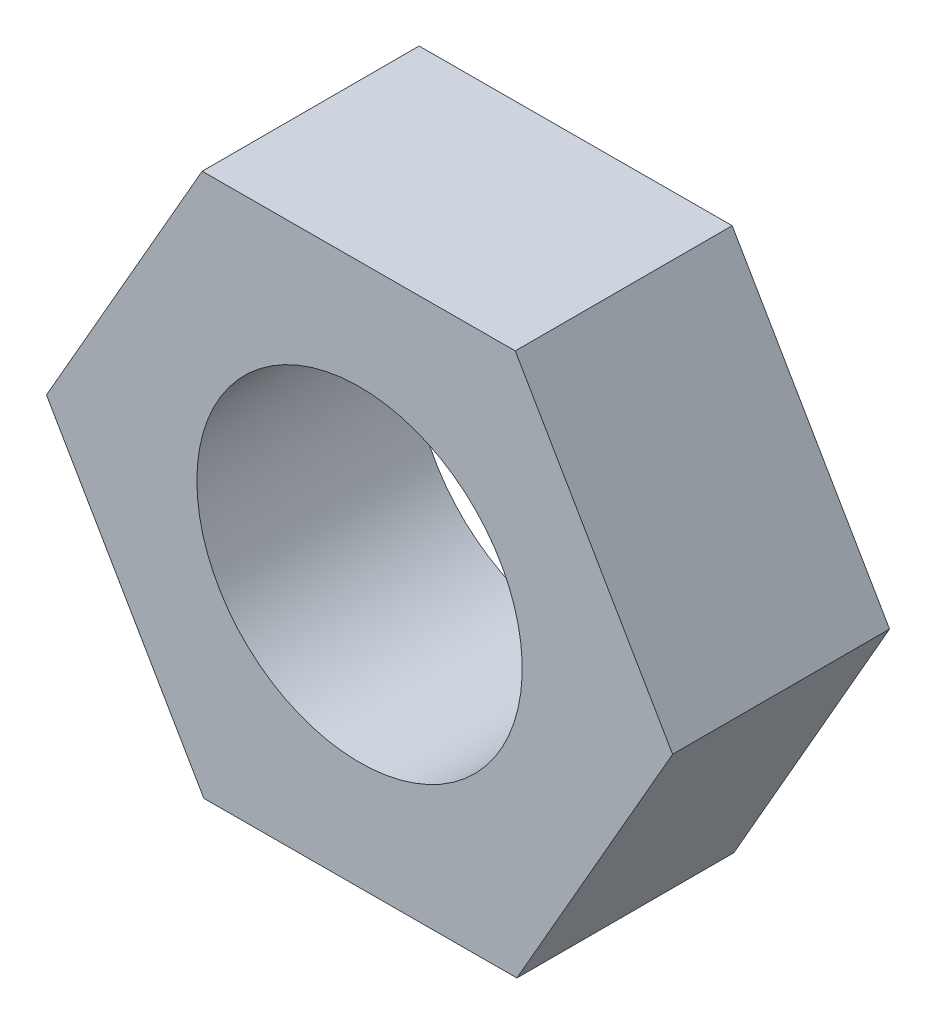
ISO-10303-21;
HEADER;
FILE_DESCRIPTION(('STEP AP214'),'2;1');
FILE_NAME('part.step','',(''),(''),'','','');
FILE_SCHEMA(('AUTOMOTIVE_DESIGN { 1 0 10303 214 1 1 1 1 }'));
ENDSEC;
DATA;
#1=APPLICATION_CONTEXT('core data for automotive mechanical design processes');
#2=APPLICATION_PROTOCOL_DEFINITION('international standard','automotive_design',2000,#1);
#3=PRODUCT_CONTEXT('',#1,'mechanical');
#4=PRODUCT('Part','Part','',(#3));
#5=PRODUCT_RELATED_PRODUCT_CATEGORY('part','',(#4));
#6=PRODUCT_DEFINITION_FORMATION('','',#4);
#7=PRODUCT_DEFINITION_CONTEXT('part definition',#1,'design');
#8=PRODUCT_DEFINITION('design','',#6,#7);
#9=PRODUCT_DEFINITION_SHAPE('','',#8);
#10=(LENGTH_UNIT() NAMED_UNIT(*) SI_UNIT(.MILLI.,.METRE.));
#11=(NAMED_UNIT(*) PLANE_ANGLE_UNIT() SI_UNIT($,.RADIAN.));
#12=(NAMED_UNIT(*) SI_UNIT($,.STERADIAN.) SOLID_ANGLE_UNIT());
#13=UNCERTAINTY_MEASURE_WITH_UNIT(LENGTH_MEASURE(1.E-05),#10,'distance_accuracy_value','');
#14=(GEOMETRIC_REPRESENTATION_CONTEXT(3) GLOBAL_UNCERTAINTY_ASSIGNED_CONTEXT((#13)) GLOBAL_UNIT_ASSIGNED_CONTEXT((#10,
#11,#12)) REPRESENTATION_CONTEXT('',''));
#15=CARTESIAN_POINT('',(0.,0.,0.));
#16=DIRECTION('',(0.,0.,1.));
#17=DIRECTION('',(1.,0.,0.));
#18=AXIS2_PLACEMENT_3D('',#15,#16,#17);
#19=CARTESIAN_POINT('',(-4.55865809690537,-7.95134231993897,6.35));
#20=DIRECTION('',(-0.00302849120600846,0.999995414109992,0.));
#21=DIRECTION('',(-0.999995414109992,-0.00302849120600846,0.));
#22=AXIS2_PLACEMENT_3D('',#19,#20,#21);
#23=PLANE('',#22);
#24=DIRECTION('',(0.999995414109992,0.00302849120600846,0.));
#25=VECTOR('',#24,1.);
#26=CARTESIAN_POINT('',(-4.55865809690537,-7.95134231993897,0.));
#27=LINE('',#26,#25);
#28=CARTESIAN_POINT('',(-4.55865809690537,-7.95134231993897,0.));
#29=VERTEX_POINT('',#28);
#30=CARTESIAN_POINT('',(4.60673539480077,-7.92358487905716,0.));
#31=VERTEX_POINT('',#30);
#32=EDGE_CURVE('E127',#29,#31,#27,.T.);
#33=ORIENTED_EDGE('',*,*,#32,.T.);
#34=DIRECTION('',(0.,0.,-1.));
#35=VECTOR('',#34,1.);
#36=CARTESIAN_POINT('',(4.60673539480077,-7.92358487905716,6.35));
#37=LINE('',#36,#35);
#38=CARTESIAN_POINT('',(4.60673539480077,-7.92358487905716,6.35));
#39=VERTEX_POINT('',#38);
#40=EDGE_CURVE('E11',#39,#31,#37,.T.);
#41=ORIENTED_EDGE('',*,*,#40,.F.);
#42=DIRECTION('',(0.999995414109992,0.00302849120600846,0.));
#43=VECTOR('',#42,1.);
#44=CARTESIAN_POINT('',(-4.55865809690537,-7.95134231993897,6.35));
#45=LINE('',#44,#43);
#46=CARTESIAN_POINT('',(-4.55865809690537,-7.95134231993897,6.35));
#47=VERTEX_POINT('',#46);
#48=EDGE_CURVE('E144',#47,#39,#45,.T.);
#49=ORIENTED_EDGE('',*,*,#48,.F.);
#50=DIRECTION('',(0.,0.,-1.));
#51=VECTOR('',#50,1.);
#52=CARTESIAN_POINT('',(-4.55865809690537,-7.95134231993897,6.35));
#53=LINE('',#52,#51);
#54=EDGE_CURVE('E123',#47,#29,#53,.T.);
#55=ORIENTED_EDGE('',*,*,#54,.T.);
#56=EDGE_LOOP('',(#33,#41,#49,#55));
#57=FACE_BOUND('',#56,.T.);
#58=ADVANCED_FACE('F38',(#57),#23,.F.);
#59=CARTESIAN_POINT('',(4.60673539480077,-7.92358487905716,6.35));
#60=DIRECTION('',(-0.867535677890198,0.497374956735454,0.));
#61=DIRECTION('',(-0.497374956735455,-0.867535677890198,0.));
#62=AXIS2_PLACEMENT_3D('',#59,#60,#61);
#63=PLANE('',#62);
#64=DIRECTION('',(0.497374956735455,0.867535677890198,0.));
#65=VECTOR('',#64,1.);
#66=CARTESIAN_POINT('',(4.60673539480077,-7.92358487905716,0.));
#67=LINE('',#66,#65);
#68=CARTESIAN_POINT('',(9.16539349170613,0.0277574408818114,0.));
#69=VERTEX_POINT('',#68);
#70=EDGE_CURVE('E131',#31,#69,#67,.T.);
#71=ORIENTED_EDGE('',*,*,#70,.T.);
#72=DIRECTION('',(0.,0.,-1.));
#73=VECTOR('',#72,1.);
#74=CARTESIAN_POINT('',(9.16539349170613,0.0277574408818114,6.35));
#75=LINE('',#74,#73);
#76=CARTESIAN_POINT('',(9.16539349170613,0.0277574408818114,6.35));
#77=VERTEX_POINT('',#76);
#78=EDGE_CURVE('E47',#77,#69,#75,.T.);
#79=ORIENTED_EDGE('',*,*,#78,.F.);
#80=DIRECTION('',(0.497374956735455,0.867535677890198,0.));
#81=VECTOR('',#80,1.);
#82=CARTESIAN_POINT('',(4.60673539480077,-7.92358487905716,6.35));
#83=LINE('',#82,#81);
#84=EDGE_CURVE('E92',#39,#77,#83,.T.);
#85=ORIENTED_EDGE('',*,*,#84,.F.);
#86=ORIENTED_EDGE('',*,*,#40,.T.);
#87=EDGE_LOOP('',(#71,#79,#85,#86));
#88=FACE_BOUND('',#87,.T.);
#89=ADVANCED_FACE('F174',(#88),#63,.F.);
#90=CARTESIAN_POINT('',(9.16539349170613,0.0277574408818114,6.35));
#91=DIRECTION('',(-0.864507186684189,-0.502620457374538,0.));
#92=DIRECTION('',(0.502620457374538,-0.864507186684189,0.));
#93=AXIS2_PLACEMENT_3D('',#90,#91,#92);
#94=PLANE('',#93);
#95=DIRECTION('',(-0.502620457374538,0.864507186684189,0.));
#96=VECTOR('',#95,1.);
#97=CARTESIAN_POINT('',(9.16539349170613,0.0277574408818114,0.));
#98=LINE('',#97,#96);
#99=CARTESIAN_POINT('',(4.55865809690538,7.95134231993897,0.));
#100=VERTEX_POINT('',#99);
#101=EDGE_CURVE('E135',#69,#100,#98,.T.);
#102=ORIENTED_EDGE('',*,*,#101,.T.);
#103=DIRECTION('',(0.,0.,-1.));
#104=VECTOR('',#103,1.);
#105=CARTESIAN_POINT('',(4.55865809690538,7.95134231993897,6.35));
#106=LINE('',#105,#104);
#107=CARTESIAN_POINT('',(4.55865809690538,7.95134231993897,6.35));
#108=VERTEX_POINT('',#107);
#109=EDGE_CURVE('E116',#108,#100,#106,.T.);
#110=ORIENTED_EDGE('',*,*,#109,.F.);
#111=DIRECTION('',(-0.502620457374538,0.864507186684189,0.));
#112=VECTOR('',#111,1.);
#113=CARTESIAN_POINT('',(9.16539349170613,0.0277574408818114,6.35));
#114=LINE('',#113,#112);
#115=EDGE_CURVE('E105',#77,#108,#114,.T.);
#116=ORIENTED_EDGE('',*,*,#115,.F.);
#117=ORIENTED_EDGE('',*,*,#78,.T.);
#118=EDGE_LOOP('',(#102,#110,#116,#117));
#119=FACE_BOUND('',#118,.T.);
#120=ADVANCED_FACE('F154',(#119),#94,.F.);
#121=CARTESIAN_POINT('',(4.55865809690538,7.95134231993897,6.35));
#122=DIRECTION('',(0.00302849120600847,-0.999995414109992,0.));
#123=DIRECTION('',(0.999995414109992,0.00302849120600847,0.));
#124=AXIS2_PLACEMENT_3D('',#121,#122,#123);
#125=PLANE('',#124);
#126=DIRECTION('',(-0.999995414109992,-0.00302849120600847,0.));
#127=VECTOR('',#126,1.);
#128=CARTESIAN_POINT('',(4.55865809690538,7.95134231993897,0.));
#129=LINE('',#128,#127);
#130=CARTESIAN_POINT('',(-4.60673539480075,7.92358487905716,0.));
#131=VERTEX_POINT('',#130);
#132=EDGE_CURVE('E114',#100,#131,#129,.T.);
#133=ORIENTED_EDGE('',*,*,#132,.T.);
#134=DIRECTION('',(0.,0.,-1.));
#135=VECTOR('',#134,1.);
#136=CARTESIAN_POINT('',(-4.60673539480075,7.92358487905716,6.35));
#137=LINE('',#136,#135);
#138=CARTESIAN_POINT('',(-4.60673539480075,7.92358487905716,6.35));
#139=VERTEX_POINT('',#138);
#140=EDGE_CURVE('E111',#139,#131,#137,.T.);
#141=ORIENTED_EDGE('',*,*,#140,.F.);
#142=DIRECTION('',(-0.999995414109992,-0.00302849120600847,0.));
#143=VECTOR('',#142,1.);
#144=CARTESIAN_POINT('',(4.55865809690538,7.95134231993897,6.35));
#145=LINE('',#144,#143);
#146=EDGE_CURVE('E99',#108,#139,#145,.T.);
#147=ORIENTED_EDGE('',*,*,#146,.F.);
#148=ORIENTED_EDGE('',*,*,#109,.T.);
#149=EDGE_LOOP('',(#133,#141,#147,#148));
#150=FACE_BOUND('',#149,.T.);
#151=ADVANCED_FACE('F112',(#150),#125,.F.);
#152=CARTESIAN_POINT('',(-4.60673539480075,7.92358487905716,6.35));
#153=DIRECTION('',(0.867535677890197,-0.497374956735455,0.));
#154=DIRECTION('',(0.497374956735455,0.867535677890197,0.));
#155=AXIS2_PLACEMENT_3D('',#152,#153,#154);
#156=PLANE('',#155);
#157=DIRECTION('',(-0.497374956735455,-0.867535677890197,0.));
#158=VECTOR('',#157,1.);
#159=CARTESIAN_POINT('',(-4.60673539480075,7.92358487905716,0.));
#160=LINE('',#159,#158);
#161=CARTESIAN_POINT('',(-9.16539349170612,-0.0277574408818105,0.));
#162=VERTEX_POINT('',#161);
#163=EDGE_CURVE('E78',#131,#162,#160,.T.);
#164=ORIENTED_EDGE('',*,*,#163,.T.);
#165=DIRECTION('',(0.,0.,-1.));
#166=VECTOR('',#165,1.);
#167=CARTESIAN_POINT('',(-9.16539349170612,-0.0277574408818105,6.35));
#168=LINE('',#167,#166);
#169=CARTESIAN_POINT('',(-9.16539349170612,-0.0277574408818105,6.35));
#170=VERTEX_POINT('',#169);
#171=EDGE_CURVE('E117',#170,#162,#168,.T.);
#172=ORIENTED_EDGE('',*,*,#171,.F.);
#173=DIRECTION('',(-0.497374956735455,-0.867535677890197,0.));
#174=VECTOR('',#173,1.);
#175=CARTESIAN_POINT('',(-4.60673539480075,7.92358487905716,6.35));
#176=LINE('',#175,#174);
#177=EDGE_CURVE('E103',#139,#170,#176,.T.);
#178=ORIENTED_EDGE('',*,*,#177,.F.);
#179=ORIENTED_EDGE('',*,*,#140,.T.);
#180=EDGE_LOOP('',(#164,#172,#178,#179));
#181=FACE_BOUND('',#180,.T.);
#182=ADVANCED_FACE('F119',(#181),#156,.F.);
#183=CARTESIAN_POINT('',(-9.16539349170612,-0.0277574408818105,6.35));
#184=DIRECTION('',(0.864507186684189,0.502620457374537,0.));
#185=DIRECTION('',(-0.502620457374537,0.864507186684189,0.));
#186=AXIS2_PLACEMENT_3D('',#183,#184,#185);
#187=PLANE('',#186);
#188=DIRECTION('',(0.502620457374537,-0.864507186684189,0.));
#189=VECTOR('',#188,1.);
#190=CARTESIAN_POINT('',(-9.16539349170612,-0.0277574408818105,0.));
#191=LINE('',#190,#189);
#192=EDGE_CURVE('E84',#162,#29,#191,.T.);
#193=ORIENTED_EDGE('',*,*,#192,.T.);
#194=ORIENTED_EDGE('',*,*,#54,.F.);
#195=DIRECTION('',(0.502620457374537,-0.864507186684189,0.));
#196=VECTOR('',#195,1.);
#197=CARTESIAN_POINT('',(-9.16539349170612,-0.0277574408818105,6.35));
#198=LINE('',#197,#196);
#199=EDGE_CURVE('E55',#170,#47,#198,.T.);
#200=ORIENTED_EDGE('',*,*,#199,.F.);
#201=ORIENTED_EDGE('',*,*,#171,.T.);
#202=EDGE_LOOP('',(#193,#194,#200,#201));
#203=FACE_BOUND('',#202,.T.);
#204=ADVANCED_FACE('F161',(#203),#187,.F.);
#205=CARTESIAN_POINT('',(0.,0.,6.35));
#206=DIRECTION('',(0.,0.,1.));
#207=DIRECTION('',(1.,0.,0.));
#208=AXIS2_PLACEMENT_3D('',#205,#206,#207);
#209=PLANE('',#208);
#210=CARTESIAN_POINT('',(0.,0.,6.35));
#211=DIRECTION('',(0.,0.,-1.));
#212=DIRECTION('',(-1.,0.,0.));
#213=AXIS2_PLACEMENT_3D('',#210,#211,#212);
#214=CIRCLE('',#213,4.7625);
#215=CARTESIAN_POINT('',(-4.7625,0.,6.35));
#216=VERTEX_POINT('',#215);
#217=EDGE_CURVE('E132',#216,#216,#214,.T.);
#218=ORIENTED_EDGE('',*,*,#217,.T.);
#219=EDGE_LOOP('',(#218));
#220=FACE_BOUND('',#219,.T.);
#221=ORIENTED_EDGE('',*,*,#48,.T.);
#222=ORIENTED_EDGE('',*,*,#84,.T.);
#223=ORIENTED_EDGE('',*,*,#115,.T.);
#224=ORIENTED_EDGE('',*,*,#146,.T.);
#225=ORIENTED_EDGE('',*,*,#177,.T.);
#226=ORIENTED_EDGE('',*,*,#199,.T.);
#227=EDGE_LOOP('',(#221,#222,#223,#224,#225,#226));
#228=FACE_BOUND('',#227,.T.);
#229=ADVANCED_FACE('F101',(#220,#228),#209,.T.);
#230=CARTESIAN_POINT('',(0.,0.,0.));
#231=DIRECTION('',(0.,0.,1.));
#232=DIRECTION('',(1.,0.,0.));
#233=AXIS2_PLACEMENT_3D('',#230,#231,#232);
#234=PLANE('',#233);
#235=CARTESIAN_POINT('',(0.,0.,0.));
#236=DIRECTION('',(0.,0.,-1.));
#237=DIRECTION('',(-1.,0.,0.));
#238=AXIS2_PLACEMENT_3D('',#235,#236,#237);
#239=CIRCLE('',#238,4.7625);
#240=CARTESIAN_POINT('',(-4.7625,0.,0.));
#241=VERTEX_POINT('',#240);
#242=EDGE_CURVE('E228',#241,#241,#239,.T.);
#243=ORIENTED_EDGE('',*,*,#242,.F.);
#244=EDGE_LOOP('',(#243));
#245=FACE_BOUND('',#244,.T.);
#246=ORIENTED_EDGE('',*,*,#32,.F.);
#247=ORIENTED_EDGE('',*,*,#192,.F.);
#248=ORIENTED_EDGE('',*,*,#163,.F.);
#249=ORIENTED_EDGE('',*,*,#132,.F.);
#250=ORIENTED_EDGE('',*,*,#101,.F.);
#251=ORIENTED_EDGE('',*,*,#70,.F.);
#252=EDGE_LOOP('',(#246,#247,#248,#249,#250,#251));
#253=FACE_BOUND('',#252,.T.);
#254=ADVANCED_FACE('F157',(#245,#253),#234,.F.);
#255=CARTESIAN_POINT('',(0.,0.,6.35));
#256=DIRECTION('',(0.,0.,-1.));
#257=DIRECTION('',(-1.,0.,0.));
#258=AXIS2_PLACEMENT_3D('',#255,#256,#257);
#259=CYLINDRICAL_SURFACE('',#258,4.7625);
#260=ORIENTED_EDGE('',*,*,#217,.F.);
#261=EDGE_LOOP('',(#260));
#262=FACE_BOUND('',#261,.T.);
#263=ORIENTED_EDGE('',*,*,#242,.T.);
#264=EDGE_LOOP('',(#263));
#265=FACE_BOUND('',#264,.T.);
#266=ADVANCED_FACE('F207',(#262,#265),#259,.F.);
#267=CLOSED_SHELL('',(#58,#89,#120,#151,#182,#204,#229,#254,#266));
#268=MANIFOLD_SOLID_BREP('B2',#267);
#269=ADVANCED_BREP_SHAPE_REPRESENTATION('',(#18,#268),#14);
#270=SHAPE_DEFINITION_REPRESENTATION(#9,#269);
ENDSEC;
END-ISO-10303-21;
